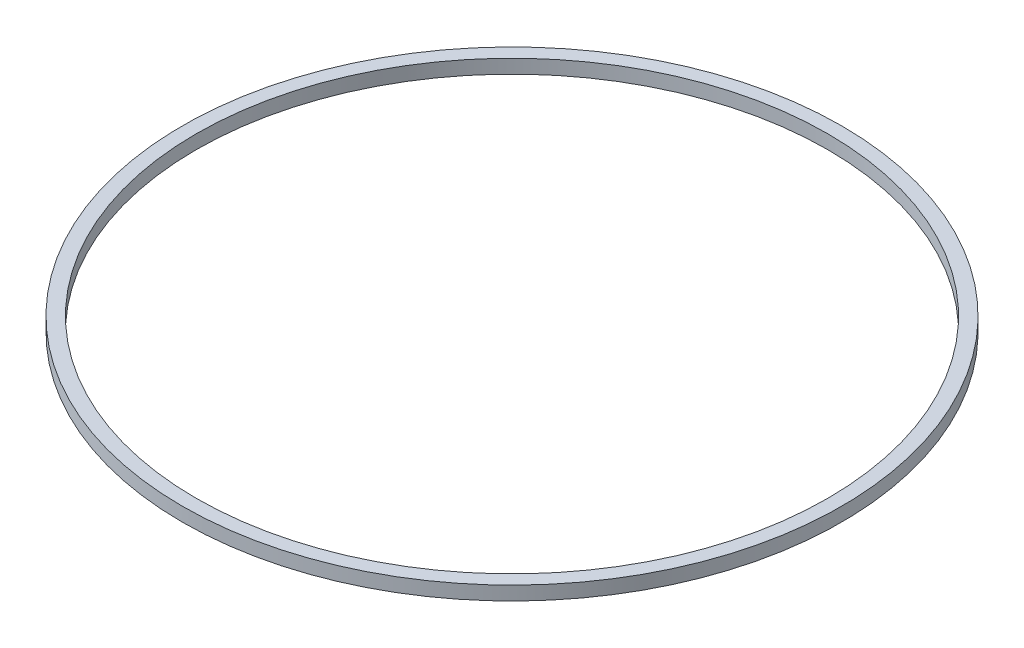
ISO-10303-21;
HEADER;
FILE_DESCRIPTION(('STEP AP214'),'2;1');
FILE_NAME('part.step','',(''),(''),'','','');
FILE_SCHEMA(('AUTOMOTIVE_DESIGN { 1 0 10303 214 1 1 1 1 }'));
ENDSEC;
DATA;
#1=APPLICATION_CONTEXT('core data for automotive mechanical design processes');
#2=APPLICATION_PROTOCOL_DEFINITION('international standard','automotive_design',2000,#1);
#3=PRODUCT_CONTEXT('',#1,'mechanical');
#4=PRODUCT('Part','Part','',(#3));
#5=PRODUCT_RELATED_PRODUCT_CATEGORY('part','',(#4));
#6=PRODUCT_DEFINITION_FORMATION('','',#4);
#7=PRODUCT_DEFINITION_CONTEXT('part definition',#1,'design');
#8=PRODUCT_DEFINITION('design','',#6,#7);
#9=PRODUCT_DEFINITION_SHAPE('','',#8);
#10=(LENGTH_UNIT() NAMED_UNIT(*) SI_UNIT(.MILLI.,.METRE.));
#11=(NAMED_UNIT(*) PLANE_ANGLE_UNIT() SI_UNIT($,.RADIAN.));
#12=(NAMED_UNIT(*) SI_UNIT($,.STERADIAN.) SOLID_ANGLE_UNIT());
#13=UNCERTAINTY_MEASURE_WITH_UNIT(LENGTH_MEASURE(1.E-05),#10,'distance_accuracy_value','');
#14=(GEOMETRIC_REPRESENTATION_CONTEXT(3) GLOBAL_UNCERTAINTY_ASSIGNED_CONTEXT((#13)) GLOBAL_UNIT_ASSIGNED_CONTEXT((#10,
#11,#12)) REPRESENTATION_CONTEXT('',''));
#15=CARTESIAN_POINT('',(0.,0.,0.));
#16=DIRECTION('',(0.,0.,1.));
#17=DIRECTION('',(1.,0.,0.));
#18=AXIS2_PLACEMENT_3D('',#15,#16,#17);
#19=CARTESIAN_POINT('',(0.,0.,0.));
#20=DIRECTION('',(0.,-1.,0.));
#21=DIRECTION('',(0.,0.,-1.));
#22=AXIS2_PLACEMENT_3D('',#19,#20,#21);
#23=CYLINDRICAL_SURFACE('',#22,48.54);
#24=CARTESIAN_POINT('',(0.,2.12132034355961,0.));
#25=DIRECTION('',(0.,-1.,0.));
#26=DIRECTION('',(0.,0.,-1.));
#27=AXIS2_PLACEMENT_3D('',#24,#25,#26);
#28=CIRCLE('',#27,48.54);
#29=CARTESIAN_POINT('',(0.,2.12132034355961,-48.54));
#30=VERTEX_POINT('',#29);
#31=EDGE_CURVE('E54',#30,#30,#28,.T.);
#32=ORIENTED_EDGE('',*,*,#31,.F.);
#33=EDGE_LOOP('',(#32));
#34=FACE_BOUND('',#33,.T.);
#35=CARTESIAN_POINT('',(0.,0.,0.));
#36=DIRECTION('',(0.,-1.,0.));
#37=DIRECTION('',(0.,0.,-1.));
#38=AXIS2_PLACEMENT_3D('',#35,#36,#37);
#39=CIRCLE('',#38,48.54);
#40=CARTESIAN_POINT('',(0.,0.,-48.54));
#41=VERTEX_POINT('',#40);
#42=EDGE_CURVE('E10',#41,#41,#39,.T.);
#43=ORIENTED_EDGE('',*,*,#42,.T.);
#44=EDGE_LOOP('',(#43));
#45=FACE_BOUND('',#44,.T.);
#46=ADVANCED_FACE('F37',(#34,#45),#23,.F.);
#47=CARTESIAN_POINT('',(-48.54,0.,0.));
#48=DIRECTION('',(0.,1.,0.));
#49=DIRECTION('',(0.,0.,1.));
#50=AXIS2_PLACEMENT_3D('',#47,#48,#49);
#51=PLANE('',#50);
#52=ORIENTED_EDGE('',*,*,#42,.F.);
#53=EDGE_LOOP('',(#52));
#54=FACE_BOUND('',#53,.T.);
#55=CARTESIAN_POINT('',(0.,0.,0.));
#56=DIRECTION('',(0.,-1.,0.));
#57=DIRECTION('',(0.,0.,-1.));
#58=AXIS2_PLACEMENT_3D('',#55,#56,#57);
#59=CIRCLE('',#58,50.6613203435596);
#60=CARTESIAN_POINT('',(0.,0.,-50.6613203435596));
#61=VERTEX_POINT('',#60);
#62=EDGE_CURVE('E44',#61,#61,#59,.T.);
#63=ORIENTED_EDGE('',*,*,#62,.T.);
#64=EDGE_LOOP('',(#63));
#65=FACE_BOUND('',#64,.T.);
#66=ADVANCED_FACE('F64',(#54,#65),#51,.F.);
#67=CARTESIAN_POINT('',(0.,0.,0.));
#68=DIRECTION('',(0.,-1.,0.));
#69=DIRECTION('',(0.,0.,-1.));
#70=AXIS2_PLACEMENT_3D('',#67,#68,#69);
#71=CYLINDRICAL_SURFACE('',#70,50.6613203435596);
#72=ORIENTED_EDGE('',*,*,#62,.F.);
#73=EDGE_LOOP('',(#72));
#74=FACE_BOUND('',#73,.T.);
#75=CARTESIAN_POINT('',(0.,2.12132034355962,0.));
#76=DIRECTION('',(0.,-1.,0.));
#77=DIRECTION('',(0.,0.,-1.));
#78=AXIS2_PLACEMENT_3D('',#75,#76,#77);
#79=CIRCLE('',#78,50.6613203435596);
#80=CARTESIAN_POINT('',(0.,2.12132034355962,-50.6613203435596));
#81=VERTEX_POINT('',#80);
#82=EDGE_CURVE('E49',#81,#81,#79,.T.);
#83=ORIENTED_EDGE('',*,*,#82,.T.);
#84=EDGE_LOOP('',(#83));
#85=FACE_BOUND('',#84,.T.);
#86=ADVANCED_FACE('F68',(#74,#85),#71,.T.);
#87=CARTESIAN_POINT('',(-50.6613203435596,2.12132034355961,0.));
#88=DIRECTION('',(0.,-1.,0.));
#89=DIRECTION('',(0.,0.,-1.));
#90=AXIS2_PLACEMENT_3D('',#87,#88,#89);
#91=PLANE('',#90);
#92=ORIENTED_EDGE('',*,*,#82,.F.);
#93=EDGE_LOOP('',(#92));
#94=FACE_BOUND('',#93,.T.);
#95=ORIENTED_EDGE('',*,*,#31,.T.);
#96=EDGE_LOOP('',(#95));
#97=FACE_BOUND('',#96,.T.);
#98=ADVANCED_FACE('F61',(#94,#97),#91,.F.);
#99=CLOSED_SHELL('',(#46,#66,#86,#98));
#100=MANIFOLD_SOLID_BREP('B2',#99);
#101=ADVANCED_BREP_SHAPE_REPRESENTATION('',(#18,#100),#14);
#102=SHAPE_DEFINITION_REPRESENTATION(#9,#101);
ENDSEC;
END-ISO-10303-21;
